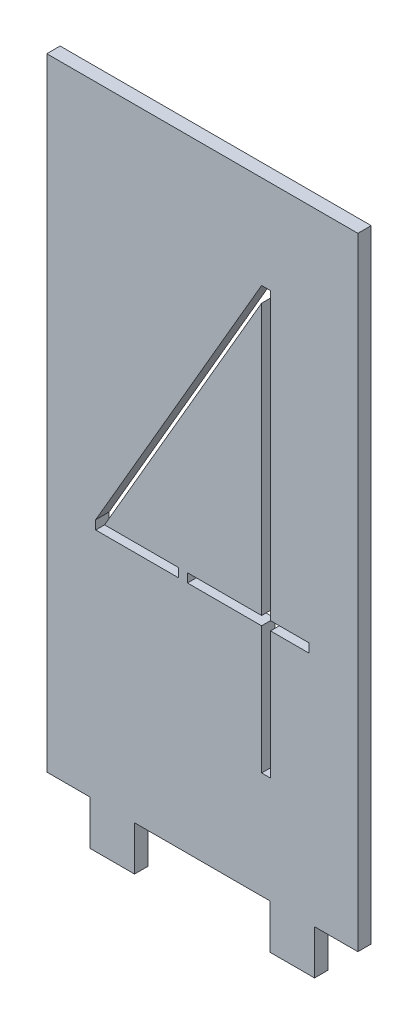
ISO-10303-21;
HEADER;
FILE_DESCRIPTION(('STEP AP214'),'2;1');
FILE_NAME('part.step','',(''),(''),'','','');
FILE_SCHEMA(('AUTOMOTIVE_DESIGN { 1 0 10303 214 1 1 1 1 }'));
ENDSEC;
DATA;
#1=APPLICATION_CONTEXT('core data for automotive mechanical design processes');
#2=APPLICATION_PROTOCOL_DEFINITION('international standard','automotive_design',2000,#1);
#3=PRODUCT_CONTEXT('',#1,'mechanical');
#4=PRODUCT('Part','Part','',(#3));
#5=PRODUCT_RELATED_PRODUCT_CATEGORY('part','',(#4));
#6=PRODUCT_DEFINITION_FORMATION('','',#4);
#7=PRODUCT_DEFINITION_CONTEXT('part definition',#1,'design');
#8=PRODUCT_DEFINITION('design','',#6,#7);
#9=PRODUCT_DEFINITION_SHAPE('','',#8);
#10=(LENGTH_UNIT() NAMED_UNIT(*) SI_UNIT(.MILLI.,.METRE.));
#11=(NAMED_UNIT(*) PLANE_ANGLE_UNIT() SI_UNIT($,.RADIAN.));
#12=(NAMED_UNIT(*) SI_UNIT($,.STERADIAN.) SOLID_ANGLE_UNIT());
#13=UNCERTAINTY_MEASURE_WITH_UNIT(LENGTH_MEASURE(1.E-05),#10,'distance_accuracy_value','');
#14=(GEOMETRIC_REPRESENTATION_CONTEXT(3) GLOBAL_UNCERTAINTY_ASSIGNED_CONTEXT((#13)) GLOBAL_UNIT_ASSIGNED_CONTEXT((#10,
#11,#12)) REPRESENTATION_CONTEXT('',''));
#15=CARTESIAN_POINT('',(0.,0.,0.));
#16=DIRECTION('',(0.,0.,1.));
#17=DIRECTION('',(1.,0.,0.));
#18=AXIS2_PLACEMENT_3D('',#15,#16,#17);
#19=CARTESIAN_POINT('',(5.49999999999999,31.342192337147,0.));
#20=DIRECTION('',(0.,-1.,0.));
#21=DIRECTION('',(0.,0.,-1.));
#22=AXIS2_PLACEMENT_3D('',#19,#20,#21);
#23=PLANE('',#22);
#24=DIRECTION('',(1.,0.,0.));
#25=VECTOR('',#24,1.);
#26=CARTESIAN_POINT('',(5.49999999999999,31.342192337147,1.5));
#27=LINE('',#26,#25);
#28=CARTESIAN_POINT('',(5.49999999999999,31.342192337147,1.5));
#29=VERTEX_POINT('',#28);
#30=CARTESIAN_POINT('',(14.8274811218701,31.342192337147,1.5));
#31=VERTEX_POINT('',#30);
#32=EDGE_CURVE('E430',#29,#31,#27,.T.);
#33=ORIENTED_EDGE('',*,*,#32,.T.);
#34=DIRECTION('',(0.,0.,-1.));
#35=VECTOR('',#34,1.);
#36=CARTESIAN_POINT('',(14.8274811218701,31.342192337147,0.));
#37=LINE('',#36,#35);
#38=CARTESIAN_POINT('',(14.8274811218701,31.342192337147,0.));
#39=VERTEX_POINT('',#38);
#40=EDGE_CURVE('E48',#31,#39,#37,.T.);
#41=ORIENTED_EDGE('',*,*,#40,.T.);
#42=DIRECTION('',(1.,0.,0.));
#43=VECTOR('',#42,1.);
#44=CARTESIAN_POINT('',(5.49999999999999,31.342192337147,0.));
#45=LINE('',#44,#43);
#46=CARTESIAN_POINT('',(5.49999999999999,31.342192337147,0.));
#47=VERTEX_POINT('',#46);
#48=EDGE_CURVE('E539',#47,#39,#45,.T.);
#49=ORIENTED_EDGE('',*,*,#48,.F.);
#50=DIRECTION('',(0.,0.,1.));
#51=VECTOR('',#50,1.);
#52=CARTESIAN_POINT('',(5.49999999999999,31.342192337147,0.));
#53=LINE('',#52,#51);
#54=EDGE_CURVE('E425',#47,#29,#53,.T.);
#55=ORIENTED_EDGE('',*,*,#54,.T.);
#56=EDGE_LOOP('',(#33,#41,#49,#55));
#57=FACE_BOUND('',#56,.T.);
#58=ADVANCED_FACE('F39',(#57),#23,.F.);
#59=CARTESIAN_POINT('',(0.,0.,1.5));
#60=DIRECTION('',(0.,1.,0.));
#61=DIRECTION('',(0.,0.,1.));
#62=AXIS2_PLACEMENT_3D('',#59,#60,#61);
#63=PLANE('',#62);
#64=DIRECTION('',(1.,0.,0.));
#65=VECTOR('',#64,1.);
#66=CARTESIAN_POINT('',(0.,0.,1.5));
#67=LINE('',#66,#65);
#68=CARTESIAN_POINT('',(4.875,0.,1.5));
#69=VERTEX_POINT('',#68);
#70=CARTESIAN_POINT('',(9.875,0.,1.5));
#71=VERTEX_POINT('',#70);
#72=EDGE_CURVE('E345',#69,#71,#67,.T.);
#73=ORIENTED_EDGE('',*,*,#72,.F.);
#74=DIRECTION('',(0.,0.,1.));
#75=VECTOR('',#74,1.);
#76=CARTESIAN_POINT('',(4.875,0.,-18.5));
#77=LINE('',#76,#75);
#78=CARTESIAN_POINT('',(4.875,0.,0.));
#79=VERTEX_POINT('',#78);
#80=EDGE_CURVE('E307',#79,#69,#77,.T.);
#81=ORIENTED_EDGE('',*,*,#80,.F.);
#82=DIRECTION('',(1.,0.,0.));
#83=VECTOR('',#82,1.);
#84=CARTESIAN_POINT('',(0.,0.,0.));
#85=LINE('',#84,#83);
#86=CARTESIAN_POINT('',(9.875,0.,0.));
#87=VERTEX_POINT('',#86);
#88=EDGE_CURVE('E298',#79,#87,#85,.T.);
#89=ORIENTED_EDGE('',*,*,#88,.T.);
#90=DIRECTION('',(0.,0.,1.));
#91=VECTOR('',#90,1.);
#92=CARTESIAN_POINT('',(9.875,0.,-18.5));
#93=LINE('',#92,#91);
#94=EDGE_CURVE('E366',#87,#71,#93,.T.);
#95=ORIENTED_EDGE('',*,*,#94,.T.);
#96=EDGE_LOOP('',(#73,#81,#89,#95));
#97=FACE_BOUND('',#96,.T.);
#98=ADVANCED_FACE('F593',(#97),#63,.F.);
#99=CARTESIAN_POINT('',(0.,0.,1.5));
#100=DIRECTION('',(1.,0.,0.));
#101=DIRECTION('',(0.,1.,0.));
#102=AXIS2_PLACEMENT_3D('',#99,#100,#101);
#103=PLANE('',#102);
#104=DIRECTION('',(0.,-1.,0.));
#105=VECTOR('',#104,1.);
#106=CARTESIAN_POINT('',(0.,0.,0.));
#107=LINE('',#106,#105);
#108=CARTESIAN_POINT('',(0.,75.,0.));
#109=VERTEX_POINT('',#108);
#110=CARTESIAN_POINT('',(0.,5.,0.));
#111=VERTEX_POINT('',#110);
#112=EDGE_CURVE('E362',#109,#111,#107,.T.);
#113=ORIENTED_EDGE('',*,*,#112,.T.);
#114=DIRECTION('',(0.,0.,1.));
#115=VECTOR('',#114,1.);
#116=CARTESIAN_POINT('',(0.,5.,-18.5));
#117=LINE('',#116,#115);
#118=CARTESIAN_POINT('',(0.,5.,1.5));
#119=VERTEX_POINT('',#118);
#120=EDGE_CURVE('E352',#111,#119,#117,.T.);
#121=ORIENTED_EDGE('',*,*,#120,.T.);
#122=DIRECTION('',(0.,-1.,0.));
#123=VECTOR('',#122,1.);
#124=CARTESIAN_POINT('',(0.,0.,1.5));
#125=LINE('',#124,#123);
#126=CARTESIAN_POINT('',(0.,75.,1.5));
#127=VERTEX_POINT('',#126);
#128=EDGE_CURVE('E370',#127,#119,#125,.T.);
#129=ORIENTED_EDGE('',*,*,#128,.F.);
#130=DIRECTION('',(0.,0.,-1.));
#131=VECTOR('',#130,1.);
#132=CARTESIAN_POINT('',(0.,75.,1.5));
#133=LINE('',#132,#131);
#134=EDGE_CURVE('E347',#127,#109,#133,.T.);
#135=ORIENTED_EDGE('',*,*,#134,.T.);
#136=EDGE_LOOP('',(#113,#121,#129,#135));
#137=FACE_BOUND('',#136,.T.);
#138=ADVANCED_FACE('F617',(#137),#103,.F.);
#139=CARTESIAN_POINT('',(25.125,0.,0.));
#140=VERTEX_POINT('',#139);
#141=CARTESIAN_POINT('',(30.125,0.,0.));
#142=VERTEX_POINT('',#141);
#143=EDGE_CURVE('E351',#140,#142,#85,.T.);
#144=ORIENTED_EDGE('',*,*,#143,.T.);
#145=DIRECTION('',(0.,0.,1.));
#146=VECTOR('',#145,1.);
#147=CARTESIAN_POINT('',(30.125,0.,-18.5));
#148=LINE('',#147,#146);
#149=CARTESIAN_POINT('',(30.125,0.,1.5));
#150=VERTEX_POINT('',#149);
#151=EDGE_CURVE('E358',#142,#150,#148,.T.);
#152=ORIENTED_EDGE('',*,*,#151,.T.);
#153=CARTESIAN_POINT('',(25.125,0.,1.5));
#154=VERTEX_POINT('',#153);
#155=EDGE_CURVE('E374',#154,#150,#67,.T.);
#156=ORIENTED_EDGE('',*,*,#155,.F.);
#157=DIRECTION('',(0.,0.,1.));
#158=VECTOR('',#157,1.);
#159=CARTESIAN_POINT('',(25.125,0.,-18.5));
#160=LINE('',#159,#158);
#161=EDGE_CURVE('E339',#140,#154,#160,.T.);
#162=ORIENTED_EDGE('',*,*,#161,.F.);
#163=EDGE_LOOP('',(#144,#152,#156,#162));
#164=FACE_BOUND('',#163,.T.);
#165=ADVANCED_FACE('F639',(#164),#63,.F.);
#166=CARTESIAN_POINT('',(35.,0.,1.5));
#167=DIRECTION('',(-1.,0.,0.));
#168=DIRECTION('',(0.,-1.,0.));
#169=AXIS2_PLACEMENT_3D('',#166,#167,#168);
#170=PLANE('',#169);
#171=DIRECTION('',(0.,1.,0.));
#172=VECTOR('',#171,1.);
#173=CARTESIAN_POINT('',(35.,0.,1.5));
#174=LINE('',#173,#172);
#175=CARTESIAN_POINT('',(35.,5.,1.5));
#176=VERTEX_POINT('',#175);
#177=CARTESIAN_POINT('',(35.,75.,1.5));
#178=VERTEX_POINT('',#177);
#179=EDGE_CURVE('E371',#176,#178,#174,.T.);
#180=ORIENTED_EDGE('',*,*,#179,.F.);
#181=DIRECTION('',(0.,0.,1.));
#182=VECTOR('',#181,1.);
#183=CARTESIAN_POINT('',(35.,5.,-18.5));
#184=LINE('',#183,#182);
#185=CARTESIAN_POINT('',(35.,5.,0.));
#186=VERTEX_POINT('',#185);
#187=EDGE_CURVE('E323',#186,#176,#184,.T.);
#188=ORIENTED_EDGE('',*,*,#187,.F.);
#189=DIRECTION('',(0.,1.,0.));
#190=VECTOR('',#189,1.);
#191=CARTESIAN_POINT('',(35.,0.,0.));
#192=LINE('',#191,#190);
#193=CARTESIAN_POINT('',(35.,75.,0.));
#194=VERTEX_POINT('',#193);
#195=EDGE_CURVE('E355',#186,#194,#192,.T.);
#196=ORIENTED_EDGE('',*,*,#195,.T.);
#197=DIRECTION('',(0.,0.,-1.));
#198=VECTOR('',#197,1.);
#199=CARTESIAN_POINT('',(35.,75.,1.5));
#200=LINE('',#199,#198);
#201=EDGE_CURVE('E341',#178,#194,#200,.T.);
#202=ORIENTED_EDGE('',*,*,#201,.F.);
#203=EDGE_LOOP('',(#180,#188,#196,#202));
#204=FACE_BOUND('',#203,.T.);
#205=ADVANCED_FACE('F630',(#204),#170,.F.);
#206=CARTESIAN_POINT('',(0.,75.,1.5));
#207=DIRECTION('',(0.,-1.,0.));
#208=DIRECTION('',(0.,0.,-1.));
#209=AXIS2_PLACEMENT_3D('',#206,#207,#208);
#210=PLANE('',#209);
#211=DIRECTION('',(-1.,0.,0.));
#212=VECTOR('',#211,1.);
#213=CARTESIAN_POINT('',(0.,75.,0.));
#214=LINE('',#213,#212);
#215=EDGE_CURVE('E346',#194,#109,#214,.T.);
#216=ORIENTED_EDGE('',*,*,#215,.T.);
#217=ORIENTED_EDGE('',*,*,#134,.F.);
#218=DIRECTION('',(-1.,0.,0.));
#219=VECTOR('',#218,1.);
#220=CARTESIAN_POINT('',(0.,75.,1.5));
#221=LINE('',#220,#219);
#222=EDGE_CURVE('E367',#178,#127,#221,.T.);
#223=ORIENTED_EDGE('',*,*,#222,.F.);
#224=ORIENTED_EDGE('',*,*,#201,.T.);
#225=EDGE_LOOP('',(#216,#217,#223,#224));
#226=FACE_BOUND('',#225,.T.);
#227=ADVANCED_FACE('F622',(#226),#210,.F.);
#228=CARTESIAN_POINT('',(0.,0.,1.5));
#229=DIRECTION('',(0.,0.,-1.));
#230=DIRECTION('',(-1.,0.,0.));
#231=AXIS2_PLACEMENT_3D('',#228,#229,#230);
#232=PLANE('',#231);
#233=DIRECTION('',(0.,1.,0.));
#234=VECTOR('',#233,1.);
#235=CARTESIAN_POINT('',(15.8274811218701,34.232967631084,1.5));
#236=LINE('',#235,#234);
#237=CARTESIAN_POINT('',(15.8274811218701,31.342192337147,1.5));
#238=VERTEX_POINT('',#237);
#239=CARTESIAN_POINT('',(15.8274811218701,32.342192337147,1.5));
#240=VERTEX_POINT('',#239);
#241=EDGE_CURVE('E294',#238,#240,#236,.T.);
#242=ORIENTED_EDGE('',*,*,#241,.T.);
#243=DIRECTION('',(1.,0.,0.));
#244=VECTOR('',#243,1.);
#245=CARTESIAN_POINT('',(6.49999999999999,32.342192337147,1.5));
#246=LINE('',#245,#244);
#247=CARTESIAN_POINT('',(24.1674811218701,32.342192337147,1.5));
#248=VERTEX_POINT('',#247);
#249=EDGE_CURVE('E280',#240,#248,#246,.T.);
#250=ORIENTED_EDGE('',*,*,#249,.T.);
#251=DIRECTION('',(0.,1.,0.));
#252=VECTOR('',#251,1.);
#253=CARTESIAN_POINT('',(24.1674811218701,32.342192337147,1.5));
#254=LINE('',#253,#252);
#255=CARTESIAN_POINT('',(24.1674811218701,62.7773354662629,1.5));
#256=VERTEX_POINT('',#255);
#257=EDGE_CURVE('E269',#248,#256,#254,.T.);
#258=ORIENTED_EDGE('',*,*,#257,.T.);
#259=DIRECTION('',(-0.50203908766614,-0.864844930872206,0.));
#260=VECTOR('',#259,1.);
#261=CARTESIAN_POINT('',(6.49999999999999,32.342192337147,1.5));
#262=LINE('',#261,#260);
#263=CARTESIAN_POINT('',(6.49999999999999,32.342192337147,1.5));
#264=VERTEX_POINT('',#263);
#265=EDGE_CURVE('E245',#256,#264,#262,.T.);
#266=ORIENTED_EDGE('',*,*,#265,.T.);
#267=CARTESIAN_POINT('',(14.8274811218701,32.342192337147,1.5));
#268=VERTEX_POINT('',#267);
#269=EDGE_CURVE('E274',#264,#268,#246,.T.);
#270=ORIENTED_EDGE('',*,*,#269,.T.);
#271=DIRECTION('',(0.,-1.,0.));
#272=VECTOR('',#271,1.);
#273=CARTESIAN_POINT('',(14.8274811218701,34.232967631084,1.5));
#274=LINE('',#273,#272);
#275=EDGE_CURVE('E290',#268,#31,#274,.T.);
#276=ORIENTED_EDGE('',*,*,#275,.T.);
#277=ORIENTED_EDGE('',*,*,#32,.F.);
#278=DIRECTION('',(0.,-1.,0.));
#279=VECTOR('',#278,1.);
#280=CARTESIAN_POINT('',(5.49999999999999,32.342192337147,1.5));
#281=LINE('',#280,#279);
#282=CARTESIAN_POINT('',(5.49999999999999,32.342192337147,1.5));
#283=VERTEX_POINT('',#282);
#284=EDGE_CURVE('E409',#283,#29,#281,.T.);
#285=ORIENTED_EDGE('',*,*,#284,.F.);
#286=DIRECTION('',(-0.50203908766614,-0.864844930872205,0.));
#287=VECTOR('',#286,1.);
#288=CARTESIAN_POINT('',(5.49999999999999,32.342192337147,1.5));
#289=LINE('',#288,#287);
#290=CARTESIAN_POINT('',(24.1674811218701,64.5,1.5));
#291=VERTEX_POINT('',#290);
#292=EDGE_CURVE('E468',#291,#283,#289,.T.);
#293=ORIENTED_EDGE('',*,*,#292,.F.);
#294=DIRECTION('',(-1.,0.,0.));
#295=VECTOR('',#294,1.);
#296=CARTESIAN_POINT('',(24.1674811218701,64.5,1.5));
#297=LINE('',#296,#295);
#298=CARTESIAN_POINT('',(25.1674811218701,64.5,1.5));
#299=VERTEX_POINT('',#298);
#300=EDGE_CURVE('E464',#299,#291,#297,.T.);
#301=ORIENTED_EDGE('',*,*,#300,.F.);
#302=DIRECTION('',(0.,1.,0.));
#303=VECTOR('',#302,1.);
#304=CARTESIAN_POINT('',(25.1674811218701,32.342192337147,1.5));
#305=LINE('',#304,#303);
#306=CARTESIAN_POINT('',(25.1674811218701,32.342192337147,1.5));
#307=VERTEX_POINT('',#306);
#308=EDGE_CURVE('E460',#307,#299,#305,.T.);
#309=ORIENTED_EDGE('',*,*,#308,.F.);
#310=DIRECTION('',(-1.,0.,0.));
#311=VECTOR('',#310,1.);
#312=CARTESIAN_POINT('',(29.5,32.342192337147,1.5));
#313=LINE('',#312,#311);
#314=CARTESIAN_POINT('',(29.5,32.342192337147,1.5));
#315=VERTEX_POINT('',#314);
#316=EDGE_CURVE('E456',#315,#307,#313,.T.);
#317=ORIENTED_EDGE('',*,*,#316,.F.);
#318=DIRECTION('',(0.,1.,0.));
#319=VECTOR('',#318,1.);
#320=CARTESIAN_POINT('',(29.5,32.342192337147,1.5));
#321=LINE('',#320,#319);
#322=CARTESIAN_POINT('',(29.5,31.342192337147,1.5));
#323=VERTEX_POINT('',#322);
#324=EDGE_CURVE('E452',#323,#315,#321,.T.);
#325=ORIENTED_EDGE('',*,*,#324,.F.);
#326=DIRECTION('',(1.,0.,0.));
#327=VECTOR('',#326,1.);
#328=CARTESIAN_POINT('',(25.1674811218701,31.342192337147,1.5));
#329=LINE('',#328,#327);
#330=CARTESIAN_POINT('',(25.1674811218701,31.342192337147,1.5));
#331=VERTEX_POINT('',#330);
#332=EDGE_CURVE('E448',#331,#323,#329,.T.);
#333=ORIENTED_EDGE('',*,*,#332,.F.);
#334=DIRECTION('',(0.,1.,0.));
#335=VECTOR('',#334,1.);
#336=CARTESIAN_POINT('',(25.1674811218701,17.,1.5));
#337=LINE('',#336,#335);
#338=CARTESIAN_POINT('',(25.1674811218701,17.,1.5));
#339=VERTEX_POINT('',#338);
#340=EDGE_CURVE('E444',#339,#331,#337,.T.);
#341=ORIENTED_EDGE('',*,*,#340,.F.);
#342=DIRECTION('',(1.,0.,0.));
#343=VECTOR('',#342,1.);
#344=CARTESIAN_POINT('',(25.1674811218701,17.,1.5));
#345=LINE('',#344,#343);
#346=CARTESIAN_POINT('',(24.1674811218701,17.,1.5));
#347=VERTEX_POINT('',#346);
#348=EDGE_CURVE('E440',#347,#339,#345,.T.);
#349=ORIENTED_EDGE('',*,*,#348,.F.);
#350=DIRECTION('',(0.,-1.,0.));
#351=VECTOR('',#350,1.);
#352=CARTESIAN_POINT('',(24.1674811218701,17.,1.5));
#353=LINE('',#352,#351);
#354=CARTESIAN_POINT('',(24.1674811218701,31.342192337147,1.5));
#355=VERTEX_POINT('',#354);
#356=EDGE_CURVE('E436',#355,#347,#353,.T.);
#357=ORIENTED_EDGE('',*,*,#356,.F.);
#358=EDGE_CURVE('E435',#238,#355,#27,.T.);
#359=ORIENTED_EDGE('',*,*,#358,.F.);
#360=EDGE_LOOP('',(#242,#250,#258,#266,#270,#276,#277,#285,#293,#301,#309,#317,#325,#333,#341,
#349,#357,#359));
#361=FACE_BOUND('',#360,.T.);
#362=DIRECTION('',(-1.,0.,0.));
#363=VECTOR('',#362,1.);
#364=CARTESIAN_POINT('',(4.875,5.,1.5));
#365=LINE('',#364,#363);
#366=CARTESIAN_POINT('',(4.875,5.,1.5));
#367=VERTEX_POINT('',#366);
#368=EDGE_CURVE('E401',#367,#119,#365,.T.);
#369=ORIENTED_EDGE('',*,*,#368,.F.);
#370=DIRECTION('',(0.,1.,0.));
#371=VECTOR('',#370,1.);
#372=CARTESIAN_POINT('',(4.875,5.,1.5));
#373=LINE('',#372,#371);
#374=EDGE_CURVE('E313',#69,#367,#373,.T.);
#375=ORIENTED_EDGE('',*,*,#374,.F.);
#376=ORIENTED_EDGE('',*,*,#72,.T.);
#377=DIRECTION('',(0.,-1.,0.));
#378=VECTOR('',#377,1.);
#379=CARTESIAN_POINT('',(9.875,0.,1.5));
#380=LINE('',#379,#378);
#381=CARTESIAN_POINT('',(9.875,5.,1.5));
#382=VERTEX_POINT('',#381);
#383=EDGE_CURVE('E335',#382,#71,#380,.T.);
#384=ORIENTED_EDGE('',*,*,#383,.F.);
#385=DIRECTION('',(-1.,0.,0.));
#386=VECTOR('',#385,1.);
#387=CARTESIAN_POINT('',(9.875,5.,1.5));
#388=LINE('',#387,#386);
#389=CARTESIAN_POINT('',(25.125,5.,1.5));
#390=VERTEX_POINT('',#389);
#391=EDGE_CURVE('E340',#390,#382,#388,.T.);
#392=ORIENTED_EDGE('',*,*,#391,.F.);
#393=DIRECTION('',(0.,1.,0.));
#394=VECTOR('',#393,1.);
#395=CARTESIAN_POINT('',(25.125,0.,1.5));
#396=LINE('',#395,#394);
#397=EDGE_CURVE('E319',#154,#390,#396,.T.);
#398=ORIENTED_EDGE('',*,*,#397,.F.);
#399=ORIENTED_EDGE('',*,*,#155,.T.);
#400=DIRECTION('',(0.,-1.,0.));
#401=VECTOR('',#400,1.);
#402=CARTESIAN_POINT('',(30.125,5.,1.5));
#403=LINE('',#402,#401);
#404=CARTESIAN_POINT('',(30.125,5.,1.5));
#405=VERTEX_POINT('',#404);
#406=EDGE_CURVE('E324',#405,#150,#403,.T.);
#407=ORIENTED_EDGE('',*,*,#406,.F.);
#408=DIRECTION('',(-1.,0.,0.));
#409=VECTOR('',#408,1.);
#410=CARTESIAN_POINT('',(30.125,5.,1.5));
#411=LINE('',#410,#409);
#412=EDGE_CURVE('E308',#176,#405,#411,.T.);
#413=ORIENTED_EDGE('',*,*,#412,.F.);
#414=ORIENTED_EDGE('',*,*,#179,.T.);
#415=ORIENTED_EDGE('',*,*,#222,.T.);
#416=ORIENTED_EDGE('',*,*,#128,.T.);
#417=EDGE_LOOP('',(#369,#375,#376,#384,#392,#398,#399,#407,#413,#414,#415,#416));
#418=FACE_BOUND('',#417,.T.);
#419=ADVANCED_FACE('F41',(#361,#418),#232,.F.);
#420=CARTESIAN_POINT('',(0.,0.,0.));
#421=DIRECTION('',(0.,0.,-1.));
#422=DIRECTION('',(-1.,0.,0.));
#423=AXIS2_PLACEMENT_3D('',#420,#421,#422);
#424=PLANE('',#423);
#425=DIRECTION('',(0.,-1.,0.));
#426=VECTOR('',#425,1.);
#427=CARTESIAN_POINT('',(14.8274811218701,34.232967631084,0.));
#428=LINE('',#427,#426);
#429=CARTESIAN_POINT('',(14.8274811218701,32.342192337147,0.));
#430=VERTEX_POINT('',#429);
#431=EDGE_CURVE('E63',#430,#39,#428,.T.);
#432=ORIENTED_EDGE('',*,*,#431,.F.);
#433=DIRECTION('',(1.,0.,0.));
#434=VECTOR('',#433,1.);
#435=CARTESIAN_POINT('',(6.49999999999999,32.342192337147,0.));
#436=LINE('',#435,#434);
#437=CARTESIAN_POINT('',(6.49999999999999,32.342192337147,0.));
#438=VERTEX_POINT('',#437);
#439=EDGE_CURVE('E262',#438,#430,#436,.T.);
#440=ORIENTED_EDGE('',*,*,#439,.F.);
#441=DIRECTION('',(-0.50203908766614,-0.864844930872206,0.));
#442=VECTOR('',#441,1.);
#443=CARTESIAN_POINT('',(6.49999999999999,32.342192337147,0.));
#444=LINE('',#443,#442);
#445=CARTESIAN_POINT('',(24.1674811218701,62.7773354662629,0.));
#446=VERTEX_POINT('',#445);
#447=EDGE_CURVE('E242',#446,#438,#444,.T.);
#448=ORIENTED_EDGE('',*,*,#447,.F.);
#449=DIRECTION('',(0.,1.,0.));
#450=VECTOR('',#449,1.);
#451=CARTESIAN_POINT('',(24.1674811218701,32.342192337147,0.));
#452=LINE('',#451,#450);
#453=CARTESIAN_POINT('',(24.1674811218701,32.342192337147,0.));
#454=VERTEX_POINT('',#453);
#455=EDGE_CURVE('E255',#454,#446,#452,.T.);
#456=ORIENTED_EDGE('',*,*,#455,.F.);
#457=CARTESIAN_POINT('',(15.8274811218701,32.342192337147,0.));
#458=VERTEX_POINT('',#457);
#459=EDGE_CURVE('E268',#458,#454,#436,.T.);
#460=ORIENTED_EDGE('',*,*,#459,.F.);
#461=DIRECTION('',(0.,1.,0.));
#462=VECTOR('',#461,1.);
#463=CARTESIAN_POINT('',(15.8274811218701,34.232967631084,0.));
#464=LINE('',#463,#462);
#465=CARTESIAN_POINT('',(15.8274811218701,31.342192337147,0.));
#466=VERTEX_POINT('',#465);
#467=EDGE_CURVE('E293',#466,#458,#464,.T.);
#468=ORIENTED_EDGE('',*,*,#467,.F.);
#469=CARTESIAN_POINT('',(24.1674811218701,31.342192337147,0.));
#470=VERTEX_POINT('',#469);
#471=EDGE_CURVE('E55',#466,#470,#45,.T.);
#472=ORIENTED_EDGE('',*,*,#471,.T.);
#473=DIRECTION('',(0.,-1.,0.));
#474=VECTOR('',#473,1.);
#475=CARTESIAN_POINT('',(24.1674811218701,17.,0.));
#476=LINE('',#475,#474);
#477=CARTESIAN_POINT('',(24.1674811218701,17.,0.));
#478=VERTEX_POINT('',#477);
#479=EDGE_CURVE('E535',#470,#478,#476,.T.);
#480=ORIENTED_EDGE('',*,*,#479,.T.);
#481=DIRECTION('',(1.,0.,0.));
#482=VECTOR('',#481,1.);
#483=CARTESIAN_POINT('',(25.1674811218701,17.,0.));
#484=LINE('',#483,#482);
#485=CARTESIAN_POINT('',(25.1674811218701,17.,0.));
#486=VERTEX_POINT('',#485);
#487=EDGE_CURVE('E531',#478,#486,#484,.T.);
#488=ORIENTED_EDGE('',*,*,#487,.T.);
#489=DIRECTION('',(0.,1.,0.));
#490=VECTOR('',#489,1.);
#491=CARTESIAN_POINT('',(25.1674811218701,17.,0.));
#492=LINE('',#491,#490);
#493=CARTESIAN_POINT('',(25.1674811218701,31.342192337147,0.));
#494=VERTEX_POINT('',#493);
#495=EDGE_CURVE('E527',#486,#494,#492,.T.);
#496=ORIENTED_EDGE('',*,*,#495,.T.);
#497=DIRECTION('',(1.,0.,0.));
#498=VECTOR('',#497,1.);
#499=CARTESIAN_POINT('',(25.1674811218701,31.342192337147,0.));
#500=LINE('',#499,#498);
#501=CARTESIAN_POINT('',(29.5,31.342192337147,0.));
#502=VERTEX_POINT('',#501);
#503=EDGE_CURVE('E523',#494,#502,#500,.T.);
#504=ORIENTED_EDGE('',*,*,#503,.T.);
#505=DIRECTION('',(0.,1.,0.));
#506=VECTOR('',#505,1.);
#507=CARTESIAN_POINT('',(29.5,32.342192337147,0.));
#508=LINE('',#507,#506);
#509=CARTESIAN_POINT('',(29.5,32.342192337147,0.));
#510=VERTEX_POINT('',#509);
#511=EDGE_CURVE('E519',#502,#510,#508,.T.);
#512=ORIENTED_EDGE('',*,*,#511,.T.);
#513=DIRECTION('',(-1.,0.,0.));
#514=VECTOR('',#513,1.);
#515=CARTESIAN_POINT('',(29.5,32.342192337147,0.));
#516=LINE('',#515,#514);
#517=CARTESIAN_POINT('',(25.1674811218701,32.342192337147,0.));
#518=VERTEX_POINT('',#517);
#519=EDGE_CURVE('E515',#510,#518,#516,.T.);
#520=ORIENTED_EDGE('',*,*,#519,.T.);
#521=DIRECTION('',(0.,1.,0.));
#522=VECTOR('',#521,1.);
#523=CARTESIAN_POINT('',(25.1674811218701,32.342192337147,0.));
#524=LINE('',#523,#522);
#525=CARTESIAN_POINT('',(25.1674811218701,64.5,0.));
#526=VERTEX_POINT('',#525);
#527=EDGE_CURVE('E511',#518,#526,#524,.T.);
#528=ORIENTED_EDGE('',*,*,#527,.T.);
#529=DIRECTION('',(-1.,0.,0.));
#530=VECTOR('',#529,1.);
#531=CARTESIAN_POINT('',(24.1674811218701,64.5,0.));
#532=LINE('',#531,#530);
#533=CARTESIAN_POINT('',(24.1674811218701,64.5,0.));
#534=VERTEX_POINT('',#533);
#535=EDGE_CURVE('E507',#526,#534,#532,.T.);
#536=ORIENTED_EDGE('',*,*,#535,.T.);
#537=DIRECTION('',(-0.50203908766614,-0.864844930872205,0.));
#538=VECTOR('',#537,1.);
#539=CARTESIAN_POINT('',(5.49999999999999,32.342192337147,0.));
#540=LINE('',#539,#538);
#541=CARTESIAN_POINT('',(5.49999999999999,32.342192337147,0.));
#542=VERTEX_POINT('',#541);
#543=EDGE_CURVE('E329',#534,#542,#540,.T.);
#544=ORIENTED_EDGE('',*,*,#543,.T.);
#545=DIRECTION('',(0.,-1.,0.));
#546=VECTOR('',#545,1.);
#547=CARTESIAN_POINT('',(5.49999999999999,32.342192337147,0.));
#548=LINE('',#547,#546);
#549=EDGE_CURVE('E381',#542,#47,#548,.T.);
#550=ORIENTED_EDGE('',*,*,#549,.T.);
#551=ORIENTED_EDGE('',*,*,#48,.T.);
#552=EDGE_LOOP('',(#432,#440,#448,#456,#460,#468,#472,#480,#488,#496,#504,#512,#520,#528,#536,
#544,#550,#551));
#553=FACE_BOUND('',#552,.T.);
#554=DIRECTION('',(0.,-1.,0.));
#555=VECTOR('',#554,1.);
#556=CARTESIAN_POINT('',(4.875,0.,0.));
#557=LINE('',#556,#555);
#558=CARTESIAN_POINT('',(4.875,5.,0.));
#559=VERTEX_POINT('',#558);
#560=EDGE_CURVE('E304',#559,#79,#557,.T.);
#561=ORIENTED_EDGE('',*,*,#560,.F.);
#562=DIRECTION('',(1.,0.,0.));
#563=VECTOR('',#562,1.);
#564=CARTESIAN_POINT('',(0.,5.,0.));
#565=LINE('',#564,#563);
#566=EDGE_CURVE('E309',#111,#559,#565,.T.);
#567=ORIENTED_EDGE('',*,*,#566,.F.);
#568=ORIENTED_EDGE('',*,*,#112,.F.);
#569=ORIENTED_EDGE('',*,*,#215,.F.);
#570=ORIENTED_EDGE('',*,*,#195,.F.);
#571=DIRECTION('',(1.,0.,0.));
#572=VECTOR('',#571,1.);
#573=CARTESIAN_POINT('',(0.,5.,0.));
#574=LINE('',#573,#572);
#575=CARTESIAN_POINT('',(30.125,5.,0.));
#576=VERTEX_POINT('',#575);
#577=EDGE_CURVE('E320',#576,#186,#574,.T.);
#578=ORIENTED_EDGE('',*,*,#577,.F.);
#579=DIRECTION('',(0.,1.,0.));
#580=VECTOR('',#579,1.);
#581=CARTESIAN_POINT('',(30.125,0.,0.));
#582=LINE('',#581,#580);
#583=EDGE_CURVE('E314',#142,#576,#582,.T.);
#584=ORIENTED_EDGE('',*,*,#583,.F.);
#585=ORIENTED_EDGE('',*,*,#143,.F.);
#586=DIRECTION('',(0.,-1.,0.));
#587=VECTOR('',#586,1.);
#588=CARTESIAN_POINT('',(25.125,0.,0.));
#589=LINE('',#588,#587);
#590=CARTESIAN_POINT('',(25.125,5.,0.));
#591=VERTEX_POINT('',#590);
#592=EDGE_CURVE('E336',#591,#140,#589,.T.);
#593=ORIENTED_EDGE('',*,*,#592,.F.);
#594=DIRECTION('',(1.,0.,0.));
#595=VECTOR('',#594,1.);
#596=CARTESIAN_POINT('',(0.,5.,0.));
#597=LINE('',#596,#595);
#598=CARTESIAN_POINT('',(9.875,5.,0.));
#599=VERTEX_POINT('',#598);
#600=EDGE_CURVE('E330',#599,#591,#597,.T.);
#601=ORIENTED_EDGE('',*,*,#600,.F.);
#602=DIRECTION('',(0.,1.,0.));
#603=VECTOR('',#602,1.);
#604=CARTESIAN_POINT('',(9.875,0.,0.));
#605=LINE('',#604,#603);
#606=EDGE_CURVE('E325',#87,#599,#605,.T.);
#607=ORIENTED_EDGE('',*,*,#606,.F.);
#608=ORIENTED_EDGE('',*,*,#88,.F.);
#609=EDGE_LOOP('',(#561,#567,#568,#569,#570,#578,#584,#585,#593,#601,#607,#608));
#610=FACE_BOUND('',#609,.T.);
#611=ADVANCED_FACE('F265',(#553,#610),#424,.T.);
#612=CARTESIAN_POINT('',(9.875,0.,-18.5));
#613=DIRECTION('',(-1.,0.,0.));
#614=DIRECTION('',(0.,-1.,0.));
#615=AXIS2_PLACEMENT_3D('',#612,#613,#614);
#616=PLANE('',#615);
#617=ORIENTED_EDGE('',*,*,#606,.T.);
#618=DIRECTION('',(0.,0.,1.));
#619=VECTOR('',#618,1.);
#620=CARTESIAN_POINT('',(9.875,5.,-18.5));
#621=LINE('',#620,#619);
#622=EDGE_CURVE('E328',#599,#382,#621,.T.);
#623=ORIENTED_EDGE('',*,*,#622,.T.);
#624=ORIENTED_EDGE('',*,*,#383,.T.);
#625=ORIENTED_EDGE('',*,*,#94,.F.);
#626=EDGE_LOOP('',(#617,#623,#624,#625));
#627=FACE_BOUND('',#626,.T.);
#628=ADVANCED_FACE('F601',(#627),#616,.F.);
#629=CARTESIAN_POINT('',(9.875,5.,-18.5));
#630=DIRECTION('',(0.,1.,0.));
#631=DIRECTION('',(0.,0.,1.));
#632=AXIS2_PLACEMENT_3D('',#629,#630,#631);
#633=PLANE('',#632);
#634=ORIENTED_EDGE('',*,*,#600,.T.);
#635=DIRECTION('',(0.,0.,1.));
#636=VECTOR('',#635,1.);
#637=CARTESIAN_POINT('',(25.125,5.,-18.5));
#638=LINE('',#637,#636);
#639=EDGE_CURVE('E334',#591,#390,#638,.T.);
#640=ORIENTED_EDGE('',*,*,#639,.T.);
#641=ORIENTED_EDGE('',*,*,#391,.T.);
#642=ORIENTED_EDGE('',*,*,#622,.F.);
#643=EDGE_LOOP('',(#634,#640,#641,#642));
#644=FACE_BOUND('',#643,.T.);
#645=ADVANCED_FACE('F603',(#644),#633,.F.);
#646=CARTESIAN_POINT('',(25.125,0.,-18.5));
#647=DIRECTION('',(1.,0.,0.));
#648=DIRECTION('',(0.,0.,-1.));
#649=AXIS2_PLACEMENT_3D('',#646,#647,#648);
#650=PLANE('',#649);
#651=ORIENTED_EDGE('',*,*,#592,.T.);
#652=ORIENTED_EDGE('',*,*,#161,.T.);
#653=ORIENTED_EDGE('',*,*,#397,.T.);
#654=ORIENTED_EDGE('',*,*,#639,.F.);
#655=EDGE_LOOP('',(#651,#652,#653,#654));
#656=FACE_BOUND('',#655,.T.);
#657=ADVANCED_FACE('F643',(#656),#650,.F.);
#658=CARTESIAN_POINT('',(30.125,5.,-18.5));
#659=DIRECTION('',(-1.,0.,0.));
#660=DIRECTION('',(0.,0.,1.));
#661=AXIS2_PLACEMENT_3D('',#658,#659,#660);
#662=PLANE('',#661);
#663=ORIENTED_EDGE('',*,*,#583,.T.);
#664=DIRECTION('',(0.,0.,1.));
#665=VECTOR('',#664,1.);
#666=CARTESIAN_POINT('',(30.125,5.,-18.5));
#667=LINE('',#666,#665);
#668=EDGE_CURVE('E318',#576,#405,#667,.T.);
#669=ORIENTED_EDGE('',*,*,#668,.T.);
#670=ORIENTED_EDGE('',*,*,#406,.T.);
#671=ORIENTED_EDGE('',*,*,#151,.F.);
#672=EDGE_LOOP('',(#663,#669,#670,#671));
#673=FACE_BOUND('',#672,.T.);
#674=ADVANCED_FACE('F637',(#673),#662,.F.);
#675=CARTESIAN_POINT('',(30.125,5.,-18.5));
#676=DIRECTION('',(0.,1.,0.));
#677=DIRECTION('',(0.,0.,1.));
#678=AXIS2_PLACEMENT_3D('',#675,#676,#677);
#679=PLANE('',#678);
#680=ORIENTED_EDGE('',*,*,#577,.T.);
#681=ORIENTED_EDGE('',*,*,#187,.T.);
#682=ORIENTED_EDGE('',*,*,#412,.T.);
#683=ORIENTED_EDGE('',*,*,#668,.F.);
#684=EDGE_LOOP('',(#680,#681,#682,#683));
#685=FACE_BOUND('',#684,.T.);
#686=ADVANCED_FACE('F633',(#685),#679,.F.);
#687=CARTESIAN_POINT('',(4.875,5.,-18.5));
#688=DIRECTION('',(1.,0.,0.));
#689=DIRECTION('',(0.,1.,0.));
#690=AXIS2_PLACEMENT_3D('',#687,#688,#689);
#691=PLANE('',#690);
#692=ORIENTED_EDGE('',*,*,#560,.T.);
#693=ORIENTED_EDGE('',*,*,#80,.T.);
#694=ORIENTED_EDGE('',*,*,#374,.T.);
#695=DIRECTION('',(0.,0.,1.));
#696=VECTOR('',#695,1.);
#697=CARTESIAN_POINT('',(4.875,5.,-18.5));
#698=LINE('',#697,#696);
#699=EDGE_CURVE('E312',#559,#367,#698,.T.);
#700=ORIENTED_EDGE('',*,*,#699,.F.);
#701=EDGE_LOOP('',(#692,#693,#694,#700));
#702=FACE_BOUND('',#701,.T.);
#703=ADVANCED_FACE('F611',(#702),#691,.F.);
#704=CARTESIAN_POINT('',(4.875,5.,-18.5));
#705=DIRECTION('',(0.,1.,0.));
#706=DIRECTION('',(-1.,0.,0.));
#707=AXIS2_PLACEMENT_3D('',#704,#705,#706);
#708=PLANE('',#707);
#709=ORIENTED_EDGE('',*,*,#566,.T.);
#710=ORIENTED_EDGE('',*,*,#699,.T.);
#711=ORIENTED_EDGE('',*,*,#368,.T.);
#712=ORIENTED_EDGE('',*,*,#120,.F.);
#713=EDGE_LOOP('',(#709,#710,#711,#712));
#714=FACE_BOUND('',#713,.T.);
#715=ADVANCED_FACE('F613',(#714),#708,.F.);
#716=CARTESIAN_POINT('',(5.49999999999999,32.342192337147,0.));
#717=DIRECTION('',(-1.,0.,0.));
#718=DIRECTION('',(0.,0.,1.));
#719=AXIS2_PLACEMENT_3D('',#716,#717,#718);
#720=PLANE('',#719);
#721=ORIENTED_EDGE('',*,*,#284,.T.);
#722=ORIENTED_EDGE('',*,*,#54,.F.);
#723=ORIENTED_EDGE('',*,*,#549,.F.);
#724=DIRECTION('',(0.,0.,1.));
#725=VECTOR('',#724,1.);
#726=CARTESIAN_POINT('',(5.49999999999999,32.342192337147,0.));
#727=LINE('',#726,#725);
#728=EDGE_CURVE('E469',#542,#283,#727,.T.);
#729=ORIENTED_EDGE('',*,*,#728,.T.);
#730=EDGE_LOOP('',(#721,#722,#723,#729));
#731=FACE_BOUND('',#730,.T.);
#732=ADVANCED_FACE('F555',(#731),#720,.F.);
#733=CARTESIAN_POINT('',(5.49999999999999,32.342192337147,0.));
#734=DIRECTION('',(-0.864844930872206,0.50203908766614,0.));
#735=DIRECTION('',(-0.50203908766614,-0.864844930872206,0.));
#736=AXIS2_PLACEMENT_3D('',#733,#734,#735);
#737=PLANE('',#736);
#738=ORIENTED_EDGE('',*,*,#292,.T.);
#739=ORIENTED_EDGE('',*,*,#728,.F.);
#740=ORIENTED_EDGE('',*,*,#543,.F.);
#741=DIRECTION('',(0.,0.,1.));
#742=VECTOR('',#741,1.);
#743=CARTESIAN_POINT('',(24.1674811218701,64.5,0.));
#744=LINE('',#743,#742);
#745=EDGE_CURVE('E465',#534,#291,#744,.T.);
#746=ORIENTED_EDGE('',*,*,#745,.T.);
#747=EDGE_LOOP('',(#738,#739,#740,#746));
#748=FACE_BOUND('',#747,.T.);
#749=ADVANCED_FACE('F695',(#748),#737,.F.);
#750=CARTESIAN_POINT('',(24.1674811218701,64.5,0.));
#751=DIRECTION('',(0.,1.,0.));
#752=DIRECTION('',(0.,0.,1.));
#753=AXIS2_PLACEMENT_3D('',#750,#751,#752);
#754=PLANE('',#753);
#755=ORIENTED_EDGE('',*,*,#300,.T.);
#756=ORIENTED_EDGE('',*,*,#745,.F.);
#757=ORIENTED_EDGE('',*,*,#535,.F.);
#758=DIRECTION('',(0.,0.,1.));
#759=VECTOR('',#758,1.);
#760=CARTESIAN_POINT('',(25.1674811218701,64.5,0.));
#761=LINE('',#760,#759);
#762=EDGE_CURVE('E461',#526,#299,#761,.T.);
#763=ORIENTED_EDGE('',*,*,#762,.T.);
#764=EDGE_LOOP('',(#755,#756,#757,#763));
#765=FACE_BOUND('',#764,.T.);
#766=ADVANCED_FACE('F691',(#765),#754,.F.);
#767=CARTESIAN_POINT('',(25.1674811218701,32.342192337147,0.));
#768=DIRECTION('',(1.,0.,0.));
#769=DIRECTION('',(0.,1.,0.));
#770=AXIS2_PLACEMENT_3D('',#767,#768,#769);
#771=PLANE('',#770);
#772=ORIENTED_EDGE('',*,*,#308,.T.);
#773=ORIENTED_EDGE('',*,*,#762,.F.);
#774=ORIENTED_EDGE('',*,*,#527,.F.);
#775=DIRECTION('',(0.,0.,1.));
#776=VECTOR('',#775,1.);
#777=CARTESIAN_POINT('',(25.1674811218701,32.342192337147,0.));
#778=LINE('',#777,#776);
#779=EDGE_CURVE('E457',#518,#307,#778,.T.);
#780=ORIENTED_EDGE('',*,*,#779,.T.);
#781=EDGE_LOOP('',(#772,#773,#774,#780));
#782=FACE_BOUND('',#781,.T.);
#783=ADVANCED_FACE('F687',(#782),#771,.F.);
#784=CARTESIAN_POINT('',(29.5,32.342192337147,0.));
#785=DIRECTION('',(0.,1.,0.));
#786=DIRECTION('',(0.,0.,1.));
#787=AXIS2_PLACEMENT_3D('',#784,#785,#786);
#788=PLANE('',#787);
#789=ORIENTED_EDGE('',*,*,#316,.T.);
#790=ORIENTED_EDGE('',*,*,#779,.F.);
#791=ORIENTED_EDGE('',*,*,#519,.F.);
#792=DIRECTION('',(0.,0.,1.));
#793=VECTOR('',#792,1.);
#794=CARTESIAN_POINT('',(29.5,32.342192337147,0.));
#795=LINE('',#794,#793);
#796=EDGE_CURVE('E453',#510,#315,#795,.T.);
#797=ORIENTED_EDGE('',*,*,#796,.T.);
#798=EDGE_LOOP('',(#789,#790,#791,#797));
#799=FACE_BOUND('',#798,.T.);
#800=ADVANCED_FACE('F683',(#799),#788,.F.);
#801=CARTESIAN_POINT('',(29.5,32.342192337147,0.));
#802=DIRECTION('',(1.,0.,0.));
#803=DIRECTION('',(0.,0.,-1.));
#804=AXIS2_PLACEMENT_3D('',#801,#802,#803);
#805=PLANE('',#804);
#806=ORIENTED_EDGE('',*,*,#324,.T.);
#807=ORIENTED_EDGE('',*,*,#796,.F.);
#808=ORIENTED_EDGE('',*,*,#511,.F.);
#809=DIRECTION('',(0.,0.,1.));
#810=VECTOR('',#809,1.);
#811=CARTESIAN_POINT('',(29.5,31.342192337147,0.));
#812=LINE('',#811,#810);
#813=EDGE_CURVE('E449',#502,#323,#812,.T.);
#814=ORIENTED_EDGE('',*,*,#813,.T.);
#815=EDGE_LOOP('',(#806,#807,#808,#814));
#816=FACE_BOUND('',#815,.T.);
#817=ADVANCED_FACE('F679',(#816),#805,.F.);
#818=CARTESIAN_POINT('',(25.1674811218701,31.342192337147,0.));
#819=DIRECTION('',(0.,-1.,0.));
#820=DIRECTION('',(0.,0.,-1.));
#821=AXIS2_PLACEMENT_3D('',#818,#819,#820);
#822=PLANE('',#821);
#823=ORIENTED_EDGE('',*,*,#332,.T.);
#824=ORIENTED_EDGE('',*,*,#813,.F.);
#825=ORIENTED_EDGE('',*,*,#503,.F.);
#826=DIRECTION('',(0.,0.,1.));
#827=VECTOR('',#826,1.);
#828=CARTESIAN_POINT('',(25.1674811218701,31.342192337147,0.));
#829=LINE('',#828,#827);
#830=EDGE_CURVE('E445',#494,#331,#829,.T.);
#831=ORIENTED_EDGE('',*,*,#830,.T.);
#832=EDGE_LOOP('',(#823,#824,#825,#831));
#833=FACE_BOUND('',#832,.T.);
#834=ADVANCED_FACE('F675',(#833),#822,.F.);
#835=CARTESIAN_POINT('',(25.1674811218701,17.,0.));
#836=DIRECTION('',(1.,0.,0.));
#837=DIRECTION('',(0.,1.,0.));
#838=AXIS2_PLACEMENT_3D('',#835,#836,#837);
#839=PLANE('',#838);
#840=ORIENTED_EDGE('',*,*,#340,.T.);
#841=ORIENTED_EDGE('',*,*,#830,.F.);
#842=ORIENTED_EDGE('',*,*,#495,.F.);
#843=DIRECTION('',(0.,0.,1.));
#844=VECTOR('',#843,1.);
#845=CARTESIAN_POINT('',(25.1674811218701,17.,0.));
#846=LINE('',#845,#844);
#847=EDGE_CURVE('E441',#486,#339,#846,.T.);
#848=ORIENTED_EDGE('',*,*,#847,.T.);
#849=EDGE_LOOP('',(#840,#841,#842,#848));
#850=FACE_BOUND('',#849,.T.);
#851=ADVANCED_FACE('F670',(#850),#839,.F.);
#852=CARTESIAN_POINT('',(25.1674811218701,17.,0.));
#853=DIRECTION('',(0.,-1.,0.));
#854=DIRECTION('',(0.,0.,-1.));
#855=AXIS2_PLACEMENT_3D('',#852,#853,#854);
#856=PLANE('',#855);
#857=ORIENTED_EDGE('',*,*,#348,.T.);
#858=ORIENTED_EDGE('',*,*,#847,.F.);
#859=ORIENTED_EDGE('',*,*,#487,.F.);
#860=DIRECTION('',(0.,0.,1.));
#861=VECTOR('',#860,1.);
#862=CARTESIAN_POINT('',(24.1674811218701,17.,0.));
#863=LINE('',#862,#861);
#864=EDGE_CURVE('E437',#478,#347,#863,.T.);
#865=ORIENTED_EDGE('',*,*,#864,.T.);
#866=EDGE_LOOP('',(#857,#858,#859,#865));
#867=FACE_BOUND('',#866,.T.);
#868=ADVANCED_FACE('F581',(#867),#856,.F.);
#869=CARTESIAN_POINT('',(24.1674811218701,17.,0.));
#870=DIRECTION('',(-1.,0.,0.));
#871=DIRECTION('',(0.,-1.,0.));
#872=AXIS2_PLACEMENT_3D('',#869,#870,#871);
#873=PLANE('',#872);
#874=ORIENTED_EDGE('',*,*,#356,.T.);
#875=ORIENTED_EDGE('',*,*,#864,.F.);
#876=ORIENTED_EDGE('',*,*,#479,.F.);
#877=DIRECTION('',(0.,0.,1.));
#878=VECTOR('',#877,1.);
#879=CARTESIAN_POINT('',(24.1674811218701,31.342192337147,0.));
#880=LINE('',#879,#878);
#881=EDGE_CURVE('E431',#470,#355,#880,.T.);
#882=ORIENTED_EDGE('',*,*,#881,.T.);
#883=EDGE_LOOP('',(#874,#875,#876,#882));
#884=FACE_BOUND('',#883,.T.);
#885=ADVANCED_FACE('F576',(#884),#873,.F.);
#886=ORIENTED_EDGE('',*,*,#471,.F.);
#887=DIRECTION('',(0.,0.,1.));
#888=VECTOR('',#887,1.);
#889=CARTESIAN_POINT('',(15.8274811218701,31.342192337147,0.));
#890=LINE('',#889,#888);
#891=EDGE_CURVE('E429',#466,#238,#890,.T.);
#892=ORIENTED_EDGE('',*,*,#891,.T.);
#893=ORIENTED_EDGE('',*,*,#358,.T.);
#894=ORIENTED_EDGE('',*,*,#881,.F.);
#895=EDGE_LOOP('',(#886,#892,#893,#894));
#896=FACE_BOUND('',#895,.T.);
#897=ADVANCED_FACE('F571',(#896),#23,.F.);
#898=CARTESIAN_POINT('',(14.8274811218701,34.232967631084,0.));
#899=DIRECTION('',(-1.,0.,0.));
#900=DIRECTION('',(0.,-1.,0.));
#901=AXIS2_PLACEMENT_3D('',#898,#899,#900);
#902=PLANE('',#901);
#903=DIRECTION('',(0.,0.,1.));
#904=VECTOR('',#903,1.);
#905=CARTESIAN_POINT('',(14.8274811218701,32.342192337147,0.));
#906=LINE('',#905,#904);
#907=EDGE_CURVE('E250',#430,#268,#906,.T.);
#908=ORIENTED_EDGE('',*,*,#907,.F.);
#909=ORIENTED_EDGE('',*,*,#431,.T.);
#910=ORIENTED_EDGE('',*,*,#40,.F.);
#911=ORIENTED_EDGE('',*,*,#275,.F.);
#912=EDGE_LOOP('',(#908,#909,#910,#911));
#913=FACE_BOUND('',#912,.T.);
#914=ADVANCED_FACE('F561',(#913),#902,.T.);
#915=CARTESIAN_POINT('',(15.8274811218701,34.232967631084,0.));
#916=DIRECTION('',(1.,0.,0.));
#917=DIRECTION('',(0.,0.,-1.));
#918=AXIS2_PLACEMENT_3D('',#915,#916,#917);
#919=PLANE('',#918);
#920=DIRECTION('',(0.,0.,-1.));
#921=VECTOR('',#920,1.);
#922=CARTESIAN_POINT('',(15.8274811218701,32.342192337147,0.));
#923=LINE('',#922,#921);
#924=EDGE_CURVE('E11',#240,#458,#923,.T.);
#925=ORIENTED_EDGE('',*,*,#924,.F.);
#926=ORIENTED_EDGE('',*,*,#241,.F.);
#927=ORIENTED_EDGE('',*,*,#891,.F.);
#928=ORIENTED_EDGE('',*,*,#467,.T.);
#929=EDGE_LOOP('',(#925,#926,#927,#928));
#930=FACE_BOUND('',#929,.T.);
#931=ADVANCED_FACE('F569',(#930),#919,.T.);
#932=CARTESIAN_POINT('',(6.49999999999999,32.342192337147,0.));
#933=DIRECTION('',(0.,-1.,0.));
#934=DIRECTION('',(0.,0.,-1.));
#935=AXIS2_PLACEMENT_3D('',#932,#933,#934);
#936=PLANE('',#935);
#937=ORIENTED_EDGE('',*,*,#439,.T.);
#938=ORIENTED_EDGE('',*,*,#907,.T.);
#939=ORIENTED_EDGE('',*,*,#269,.F.);
#940=DIRECTION('',(0.,0.,1.));
#941=VECTOR('',#940,1.);
#942=CARTESIAN_POINT('',(6.49999999999999,32.342192337147,0.));
#943=LINE('',#942,#941);
#944=EDGE_CURVE('E261',#438,#264,#943,.T.);
#945=ORIENTED_EDGE('',*,*,#944,.F.);
#946=EDGE_LOOP('',(#937,#938,#939,#945));
#947=FACE_BOUND('',#946,.T.);
#948=ADVANCED_FACE('F563',(#947),#936,.T.);
#949=ORIENTED_EDGE('',*,*,#249,.F.);
#950=ORIENTED_EDGE('',*,*,#924,.T.);
#951=ORIENTED_EDGE('',*,*,#459,.T.);
#952=DIRECTION('',(0.,0.,1.));
#953=VECTOR('',#952,1.);
#954=CARTESIAN_POINT('',(24.1674811218701,32.342192337147,0.));
#955=LINE('',#954,#953);
#956=EDGE_CURVE('E251',#454,#248,#955,.T.);
#957=ORIENTED_EDGE('',*,*,#956,.T.);
#958=EDGE_LOOP('',(#949,#950,#951,#957));
#959=FACE_BOUND('',#958,.T.);
#960=ADVANCED_FACE('F565',(#959),#936,.T.);
#961=CARTESIAN_POINT('',(24.1674811218701,32.342192337147,0.));
#962=DIRECTION('',(1.,0.,0.));
#963=DIRECTION('',(0.,1.,0.));
#964=AXIS2_PLACEMENT_3D('',#961,#962,#963);
#965=PLANE('',#964);
#966=ORIENTED_EDGE('',*,*,#257,.F.);
#967=ORIENTED_EDGE('',*,*,#956,.F.);
#968=ORIENTED_EDGE('',*,*,#455,.T.);
#969=DIRECTION('',(0.,0.,1.));
#970=VECTOR('',#969,1.);
#971=CARTESIAN_POINT('',(24.1674811218701,62.7773354662629,0.));
#972=LINE('',#971,#970);
#973=EDGE_CURVE('E238',#446,#256,#972,.T.);
#974=ORIENTED_EDGE('',*,*,#973,.T.);
#975=EDGE_LOOP('',(#966,#967,#968,#974));
#976=FACE_BOUND('',#975,.T.);
#977=ADVANCED_FACE('F256',(#976),#965,.T.);
#978=CARTESIAN_POINT('',(6.49999999999999,32.342192337147,0.));
#979=DIRECTION('',(-0.864844930872206,0.50203908766614,0.));
#980=DIRECTION('',(-0.50203908766614,-0.864844930872206,0.));
#981=AXIS2_PLACEMENT_3D('',#978,#979,#980);
#982=PLANE('',#981);
#983=ORIENTED_EDGE('',*,*,#265,.F.);
#984=ORIENTED_EDGE('',*,*,#973,.F.);
#985=ORIENTED_EDGE('',*,*,#447,.T.);
#986=ORIENTED_EDGE('',*,*,#944,.T.);
#987=EDGE_LOOP('',(#983,#984,#985,#986));
#988=FACE_BOUND('',#987,.T.);
#989=ADVANCED_FACE('F240',(#988),#982,.T.);
#990=CLOSED_SHELL('',(#58,#98,#138,#165,#205,#227,#419,#611,#628,#645,#657,#674,#686,#703,#715,
#732,#749,#766,#783,#800,#817,#834,#851,#868,#885,#897,#914,#931,#948,#960,#977,#989));
#991=MANIFOLD_SOLID_BREP('B2',#990);
#992=ADVANCED_BREP_SHAPE_REPRESENTATION('',(#18,#991),#14);
#993=SHAPE_DEFINITION_REPRESENTATION(#9,#992);
ENDSEC;
END-ISO-10303-21;
